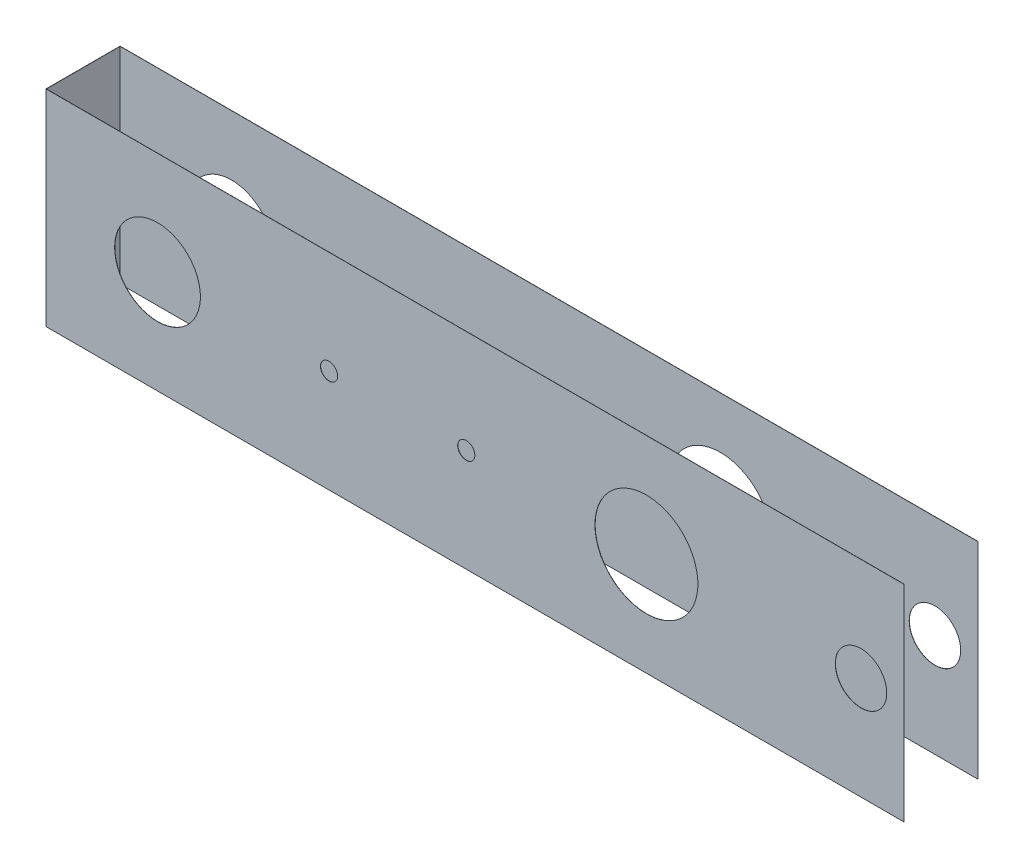
ISO-10303-21;
HEADER;
FILE_DESCRIPTION(('STEP AP214'),'2;1');
FILE_NAME('part.step','',(''),(''),'','','');
FILE_SCHEMA(('AUTOMOTIVE_DESIGN { 1 0 10303 214 1 1 1 1 }'));
ENDSEC;
DATA;
#1=APPLICATION_CONTEXT('core data for automotive mechanical design processes');
#2=APPLICATION_PROTOCOL_DEFINITION('international standard','automotive_design',2000,#1);
#3=PRODUCT_CONTEXT('',#1,'mechanical');
#4=PRODUCT('Part','Part','',(#3));
#5=PRODUCT_RELATED_PRODUCT_CATEGORY('part','',(#4));
#6=PRODUCT_DEFINITION_FORMATION('','',#4);
#7=PRODUCT_DEFINITION_CONTEXT('part definition',#1,'design');
#8=PRODUCT_DEFINITION('design','',#6,#7);
#9=PRODUCT_DEFINITION_SHAPE('','',#8);
#10=(LENGTH_UNIT() NAMED_UNIT(*) SI_UNIT(.MILLI.,.METRE.));
#11=(NAMED_UNIT(*) PLANE_ANGLE_UNIT() SI_UNIT($,.RADIAN.));
#12=(NAMED_UNIT(*) SI_UNIT($,.STERADIAN.) SOLID_ANGLE_UNIT());
#13=UNCERTAINTY_MEASURE_WITH_UNIT(LENGTH_MEASURE(1.E-05),#10,'distance_accuracy_value','');
#14=(GEOMETRIC_REPRESENTATION_CONTEXT(3) GLOBAL_UNCERTAINTY_ASSIGNED_CONTEXT((#13)) GLOBAL_UNIT_ASSIGNED_CONTEXT((#10,
#11,#12)) REPRESENTATION_CONTEXT('',''));
#15=CARTESIAN_POINT('',(0.,0.,0.));
#16=DIRECTION('',(0.,0.,1.));
#17=DIRECTION('',(1.,0.,0.));
#18=AXIS2_PLACEMENT_3D('',#15,#16,#17);
#19=CARTESIAN_POINT('',(815.722184808822,120.,-138.235459402051));
#20=DIRECTION('',(-1.,0.,0.));
#21=DIRECTION('',(0.,0.,1.));
#22=AXIS2_PLACEMENT_3D('',#19,#20,#21);
#23=PLANE('',#22);
#24=DIRECTION('',(0.,0.,-1.));
#25=VECTOR('',#24,1.);
#26=CARTESIAN_POINT('',(815.722184808822,0.,-138.235459402051));
#27=LINE('',#26,#25);
#28=CARTESIAN_POINT('',(815.722184808822,0.,-138.235459402051));
#29=VERTEX_POINT('',#28);
#30=CARTESIAN_POINT('',(815.722184808822,0.,-138.335459402051));
#31=VERTEX_POINT('',#30);
#32=EDGE_CURVE('E133',#29,#31,#27,.T.);
#33=ORIENTED_EDGE('',*,*,#32,.T.);
#34=DIRECTION('',(0.,-1.,0.));
#35=VECTOR('',#34,1.);
#36=CARTESIAN_POINT('',(815.722184808822,120.,-138.335459402051));
#37=LINE('',#36,#35);
#38=CARTESIAN_POINT('',(815.722184808822,120.,-138.335459402051));
#39=VERTEX_POINT('',#38);
#40=EDGE_CURVE('E11',#39,#31,#37,.T.);
#41=ORIENTED_EDGE('',*,*,#40,.F.);
#42=DIRECTION('',(0.,0.,-1.));
#43=VECTOR('',#42,1.);
#44=CARTESIAN_POINT('',(815.722184808822,120.,-138.235459402051));
#45=LINE('',#44,#43);
#46=CARTESIAN_POINT('',(815.722184808822,120.,-138.235459402051));
#47=VERTEX_POINT('',#46);
#48=EDGE_CURVE('E148',#47,#39,#45,.T.);
#49=ORIENTED_EDGE('',*,*,#48,.F.);
#50=DIRECTION('',(0.,-1.,0.));
#51=VECTOR('',#50,1.);
#52=CARTESIAN_POINT('',(815.722184808822,120.,-138.235459402051));
#53=LINE('',#52,#51);
#54=EDGE_CURVE('E129',#47,#29,#53,.T.);
#55=ORIENTED_EDGE('',*,*,#54,.T.);
#56=EDGE_LOOP('',(#33,#41,#49,#55));
#57=FACE_BOUND('',#56,.T.);
#58=ADVANCED_FACE('F35',(#57),#23,.F.);
#59=CARTESIAN_POINT('',(815.722184808822,120.,-138.335459402051));
#60=DIRECTION('',(0.,0.,1.));
#61=DIRECTION('',(1.,0.,0.));
#62=AXIS2_PLACEMENT_3D('',#59,#60,#61);
#63=PLANE('',#62);
#64=CARTESIAN_POINT('',(380.622184808822,60.,-138.335459402051));
#65=DIRECTION('',(0.,0.,-1.));
#66=DIRECTION('',(-1.,0.,0.));
#67=AXIS2_PLACEMENT_3D('',#64,#65,#66);
#68=CIRCLE('',#67,25.);
#69=CARTESIAN_POINT('',(355.622184808822,60.,-138.335459402051));
#70=VERTEX_POINT('',#69);
#71=EDGE_CURVE('E169',#70,#70,#68,.T.);
#72=ORIENTED_EDGE('',*,*,#71,.F.);
#73=EDGE_LOOP('',(#72));
#74=FACE_BOUND('',#73,.T.);
#75=CARTESIAN_POINT('',(480.622184808822,60.,-138.335459402051));
#76=DIRECTION('',(0.,0.,-1.));
#77=DIRECTION('',(-1.,0.,0.));
#78=AXIS2_PLACEMENT_3D('',#75,#76,#77);
#79=CIRCLE('',#78,4.99999999999999);
#80=CARTESIAN_POINT('',(475.622184808822,60.,-138.335459402051));
#81=VERTEX_POINT('',#80);
#82=EDGE_CURVE('E396',#81,#81,#79,.T.);
#83=ORIENTED_EDGE('',*,*,#82,.F.);
#84=EDGE_LOOP('',(#83));
#85=FACE_BOUND('',#84,.T.);
#86=CARTESIAN_POINT('',(560.622184808822,60.,-138.335459402051));
#87=DIRECTION('',(0.,0.,-1.));
#88=DIRECTION('',(-1.,0.,0.));
#89=AXIS2_PLACEMENT_3D('',#86,#87,#88);
#90=CIRCLE('',#89,5.00000000000005);
#91=CARTESIAN_POINT('',(555.622184808822,60.,-138.335459402051));
#92=VERTEX_POINT('',#91);
#93=EDGE_CURVE('E393',#92,#92,#90,.T.);
#94=ORIENTED_EDGE('',*,*,#93,.F.);
#95=EDGE_LOOP('',(#94));
#96=FACE_BOUND('',#95,.T.);
#97=CARTESIAN_POINT('',(665.622184808822,59.9999999999999,-138.335459402051));
#98=DIRECTION('',(0.,0.,-1.));
#99=DIRECTION('',(-1.,0.,0.));
#100=AXIS2_PLACEMENT_3D('',#97,#98,#99);
#101=CIRCLE('',#100,30.);
#102=CARTESIAN_POINT('',(635.622184808822,59.9999999999999,-138.335459402051));
#103=VERTEX_POINT('',#102);
#104=EDGE_CURVE('E390',#103,#103,#101,.T.);
#105=ORIENTED_EDGE('',*,*,#104,.F.);
#106=EDGE_LOOP('',(#105));
#107=FACE_BOUND('',#106,.T.);
#108=CARTESIAN_POINT('',(790.722184808822,60.,-138.335459402051));
#109=DIRECTION('',(0.,0.,-1.));
#110=DIRECTION('',(-1.,0.,0.));
#111=AXIS2_PLACEMENT_3D('',#108,#109,#110);
#112=CIRCLE('',#111,15.);
#113=CARTESIAN_POINT('',(775.722184808822,60.,-138.335459402051));
#114=VERTEX_POINT('',#113);
#115=EDGE_CURVE('E164',#114,#114,#112,.T.);
#116=ORIENTED_EDGE('',*,*,#115,.F.);
#117=EDGE_LOOP('',(#116));
#118=FACE_BOUND('',#117,.T.);
#119=DIRECTION('',(-1.,0.,0.));
#120=VECTOR('',#119,1.);
#121=CARTESIAN_POINT('',(815.722184808822,0.,-138.335459402051));
#122=LINE('',#121,#120);
#123=CARTESIAN_POINT('',(315.622184808822,0.,-138.335459402051));
#124=VERTEX_POINT('',#123);
#125=EDGE_CURVE('E136',#31,#124,#122,.T.);
#126=ORIENTED_EDGE('',*,*,#125,.T.);
#127=DIRECTION('',(0.,-1.,0.));
#128=VECTOR('',#127,1.);
#129=CARTESIAN_POINT('',(315.622184808822,120.,-138.335459402051));
#130=LINE('',#129,#128);
#131=CARTESIAN_POINT('',(315.622184808822,120.,-138.335459402051));
#132=VERTEX_POINT('',#131);
#133=EDGE_CURVE('E44',#132,#124,#130,.T.);
#134=ORIENTED_EDGE('',*,*,#133,.F.);
#135=DIRECTION('',(-1.,0.,0.));
#136=VECTOR('',#135,1.);
#137=CARTESIAN_POINT('',(815.722184808822,120.,-138.335459402051));
#138=LINE('',#137,#136);
#139=EDGE_CURVE('E96',#39,#132,#138,.T.);
#140=ORIENTED_EDGE('',*,*,#139,.F.);
#141=ORIENTED_EDGE('',*,*,#40,.T.);
#142=EDGE_LOOP('',(#126,#134,#140,#141));
#143=FACE_BOUND('',#142,.T.);
#144=ADVANCED_FACE('F240',(#74,#85,#96,#107,#118,#143),#63,.F.);
#145=CARTESIAN_POINT('',(315.622184808822,120.,-138.335459402051));
#146=DIRECTION('',(1.,0.,0.));
#147=DIRECTION('',(0.,0.,-1.));
#148=AXIS2_PLACEMENT_3D('',#145,#146,#147);
#149=PLANE('',#148);
#150=DIRECTION('',(0.,0.,1.));
#151=VECTOR('',#150,1.);
#152=CARTESIAN_POINT('',(315.622184808822,0.,-138.335459402051));
#153=LINE('',#152,#151);
#154=CARTESIAN_POINT('',(315.622184808822,0.,-95.1354594020514));
#155=VERTEX_POINT('',#154);
#156=EDGE_CURVE('E139',#124,#155,#153,.T.);
#157=ORIENTED_EDGE('',*,*,#156,.T.);
#158=DIRECTION('',(0.,-1.,0.));
#159=VECTOR('',#158,1.);
#160=CARTESIAN_POINT('',(315.622184808822,120.,-95.1354594020514));
#161=LINE('',#160,#159);
#162=CARTESIAN_POINT('',(315.622184808822,120.,-95.1354594020514));
#163=VERTEX_POINT('',#162);
#164=EDGE_CURVE('E155',#163,#155,#161,.T.);
#165=ORIENTED_EDGE('',*,*,#164,.F.);
#166=DIRECTION('',(0.,0.,1.));
#167=VECTOR('',#166,1.);
#168=CARTESIAN_POINT('',(315.622184808822,120.,-138.335459402051));
#169=LINE('',#168,#167);
#170=EDGE_CURVE('E207',#132,#163,#169,.T.);
#171=ORIENTED_EDGE('',*,*,#170,.F.);
#172=ORIENTED_EDGE('',*,*,#133,.T.);
#173=EDGE_LOOP('',(#157,#165,#171,#172));
#174=FACE_BOUND('',#173,.T.);
#175=ADVANCED_FACE('F244',(#174),#149,.F.);
#176=CARTESIAN_POINT('',(315.622184808822,120.,-95.1354594020514));
#177=DIRECTION('',(0.,0.,-1.));
#178=DIRECTION('',(-1.,0.,0.));
#179=AXIS2_PLACEMENT_3D('',#176,#177,#178);
#180=PLANE('',#179);
#181=CARTESIAN_POINT('',(380.622184808822,60.,-95.1354594020513));
#182=DIRECTION('',(0.,0.,-1.));
#183=DIRECTION('',(-1.,0.,0.));
#184=AXIS2_PLACEMENT_3D('',#181,#182,#183);
#185=CIRCLE('',#184,25.);
#186=CARTESIAN_POINT('',(355.622184808822,60.,-95.1354594020513));
#187=VERTEX_POINT('',#186);
#188=EDGE_CURVE('E196',#187,#187,#185,.T.);
#189=ORIENTED_EDGE('',*,*,#188,.T.);
#190=EDGE_LOOP('',(#189));
#191=FACE_BOUND('',#190,.T.);
#192=CARTESIAN_POINT('',(480.622184808822,60.,-95.1354594020513));
#193=DIRECTION('',(0.,0.,-1.));
#194=DIRECTION('',(-1.,0.,0.));
#195=AXIS2_PLACEMENT_3D('',#192,#193,#194);
#196=CIRCLE('',#195,4.99999999999999);
#197=CARTESIAN_POINT('',(475.622184808822,60.,-95.1354594020513));
#198=VERTEX_POINT('',#197);
#199=EDGE_CURVE('E181',#198,#198,#196,.T.);
#200=ORIENTED_EDGE('',*,*,#199,.T.);
#201=EDGE_LOOP('',(#200));
#202=FACE_BOUND('',#201,.T.);
#203=CARTESIAN_POINT('',(560.622184808822,60.,-95.1354594020513));
#204=DIRECTION('',(0.,0.,-1.));
#205=DIRECTION('',(-1.,0.,0.));
#206=AXIS2_PLACEMENT_3D('',#203,#204,#205);
#207=CIRCLE('',#206,5.00000000000005);
#208=CARTESIAN_POINT('',(555.622184808822,60.,-95.1354594020513));
#209=VERTEX_POINT('',#208);
#210=EDGE_CURVE('E177',#209,#209,#207,.T.);
#211=ORIENTED_EDGE('',*,*,#210,.T.);
#212=EDGE_LOOP('',(#211));
#213=FACE_BOUND('',#212,.T.);
#214=CARTESIAN_POINT('',(665.622184808822,59.9999999999999,-95.1354594020513));
#215=DIRECTION('',(0.,0.,-1.));
#216=DIRECTION('',(-1.,0.,0.));
#217=AXIS2_PLACEMENT_3D('',#214,#215,#216);
#218=CIRCLE('',#217,30.);
#219=CARTESIAN_POINT('',(635.622184808822,59.9999999999999,-95.1354594020513));
#220=VERTEX_POINT('',#219);
#221=EDGE_CURVE('E173',#220,#220,#218,.T.);
#222=ORIENTED_EDGE('',*,*,#221,.T.);
#223=EDGE_LOOP('',(#222));
#224=FACE_BOUND('',#223,.T.);
#225=CARTESIAN_POINT('',(790.722184808822,60.,-95.1354594020513));
#226=DIRECTION('',(0.,0.,-1.));
#227=DIRECTION('',(-1.,0.,0.));
#228=AXIS2_PLACEMENT_3D('',#225,#226,#227);
#229=CIRCLE('',#228,15.);
#230=CARTESIAN_POINT('',(775.722184808822,60.,-95.1354594020513));
#231=VERTEX_POINT('',#230);
#232=EDGE_CURVE('E137',#231,#231,#229,.T.);
#233=ORIENTED_EDGE('',*,*,#232,.T.);
#234=EDGE_LOOP('',(#233));
#235=FACE_BOUND('',#234,.T.);
#236=DIRECTION('',(1.,0.,0.));
#237=VECTOR('',#236,1.);
#238=CARTESIAN_POINT('',(315.622184808822,0.,-95.1354594020514));
#239=LINE('',#238,#237);
#240=CARTESIAN_POINT('',(815.722184808822,0.,-95.1354594020513));
#241=VERTEX_POINT('',#240);
#242=EDGE_CURVE('E141',#155,#241,#239,.T.);
#243=ORIENTED_EDGE('',*,*,#242,.T.);
#244=DIRECTION('',(0.,-1.,0.));
#245=VECTOR('',#244,1.);
#246=CARTESIAN_POINT('',(815.722184808822,120.,-95.1354594020513));
#247=LINE('',#246,#245);
#248=CARTESIAN_POINT('',(815.722184808822,120.,-95.1354594020513));
#249=VERTEX_POINT('',#248);
#250=EDGE_CURVE('E152',#249,#241,#247,.T.);
#251=ORIENTED_EDGE('',*,*,#250,.F.);
#252=DIRECTION('',(1.,0.,0.));
#253=VECTOR('',#252,1.);
#254=CARTESIAN_POINT('',(315.622184808822,120.,-95.1354594020514));
#255=LINE('',#254,#253);
#256=EDGE_CURVE('E209',#163,#249,#255,.T.);
#257=ORIENTED_EDGE('',*,*,#256,.F.);
#258=ORIENTED_EDGE('',*,*,#164,.T.);
#259=EDGE_LOOP('',(#243,#251,#257,#258));
#260=FACE_BOUND('',#259,.T.);
#261=ADVANCED_FACE('F215',(#191,#202,#213,#224,#235,#260),#180,.F.);
#262=CARTESIAN_POINT('',(815.722184808822,120.,-95.1354594020513));
#263=DIRECTION('',(-1.,0.,0.));
#264=DIRECTION('',(0.,0.,1.));
#265=AXIS2_PLACEMENT_3D('',#262,#263,#264);
#266=PLANE('',#265);
#267=DIRECTION('',(0.,0.,-1.));
#268=VECTOR('',#267,1.);
#269=CARTESIAN_POINT('',(815.722184808822,0.,-95.1354594020513));
#270=LINE('',#269,#268);
#271=CARTESIAN_POINT('',(815.722184808822,0.,-95.2354594020514));
#272=VERTEX_POINT('',#271);
#273=EDGE_CURVE('E143',#241,#272,#270,.T.);
#274=ORIENTED_EDGE('',*,*,#273,.T.);
#275=DIRECTION('',(0.,-1.,0.));
#276=VECTOR('',#275,1.);
#277=CARTESIAN_POINT('',(815.722184808822,120.,-95.2354594020514));
#278=LINE('',#277,#276);
#279=CARTESIAN_POINT('',(815.722184808822,120.,-95.2354594020514));
#280=VERTEX_POINT('',#279);
#281=EDGE_CURVE('E124',#280,#272,#278,.T.);
#282=ORIENTED_EDGE('',*,*,#281,.F.);
#283=DIRECTION('',(0.,0.,-1.));
#284=VECTOR('',#283,1.);
#285=CARTESIAN_POINT('',(815.722184808822,120.,-95.1354594020513));
#286=LINE('',#285,#284);
#287=EDGE_CURVE('E115',#249,#280,#286,.T.);
#288=ORIENTED_EDGE('',*,*,#287,.F.);
#289=ORIENTED_EDGE('',*,*,#250,.T.);
#290=EDGE_LOOP('',(#274,#282,#288,#289));
#291=FACE_BOUND('',#290,.T.);
#292=ADVANCED_FACE('F219',(#291),#266,.F.);
#293=CARTESIAN_POINT('',(815.722184808822,120.,-95.2354594020514));
#294=DIRECTION('',(0.,0.,1.));
#295=DIRECTION('',(1.,0.,0.));
#296=AXIS2_PLACEMENT_3D('',#293,#294,#295);
#297=PLANE('',#296);
#298=CARTESIAN_POINT('',(380.622184808822,60.,-95.2354594020514));
#299=DIRECTION('',(0.,0.,1.));
#300=DIRECTION('',(1.,0.,0.));
#301=AXIS2_PLACEMENT_3D('',#298,#299,#300);
#302=CIRCLE('',#301,25.);
#303=CARTESIAN_POINT('',(405.622184808822,60.,-95.2354594020514));
#304=VERTEX_POINT('',#303);
#305=EDGE_CURVE('E193',#304,#304,#302,.T.);
#306=ORIENTED_EDGE('',*,*,#305,.T.);
#307=EDGE_LOOP('',(#306));
#308=FACE_BOUND('',#307,.T.);
#309=CARTESIAN_POINT('',(480.622184808822,60.,-95.2354594020514));
#310=DIRECTION('',(0.,0.,1.));
#311=DIRECTION('',(1.,0.,0.));
#312=AXIS2_PLACEMENT_3D('',#309,#310,#311);
#313=CIRCLE('',#312,4.99999999999999);
#314=CARTESIAN_POINT('',(485.622184808822,60.,-95.2354594020514));
#315=VERTEX_POINT('',#314);
#316=EDGE_CURVE('E176',#315,#315,#313,.T.);
#317=ORIENTED_EDGE('',*,*,#316,.T.);
#318=EDGE_LOOP('',(#317));
#319=FACE_BOUND('',#318,.T.);
#320=CARTESIAN_POINT('',(560.622184808822,60.,-95.2354594020514));
#321=DIRECTION('',(0.,0.,1.));
#322=DIRECTION('',(1.,0.,0.));
#323=AXIS2_PLACEMENT_3D('',#320,#321,#322);
#324=CIRCLE('',#323,5.00000000000005);
#325=CARTESIAN_POINT('',(565.622184808822,60.,-95.2354594020514));
#326=VERTEX_POINT('',#325);
#327=EDGE_CURVE('E172',#326,#326,#324,.T.);
#328=ORIENTED_EDGE('',*,*,#327,.T.);
#329=EDGE_LOOP('',(#328));
#330=FACE_BOUND('',#329,.T.);
#331=CARTESIAN_POINT('',(665.622184808822,59.9999999999999,-95.2354594020514));
#332=DIRECTION('',(0.,0.,1.));
#333=DIRECTION('',(1.,0.,0.));
#334=AXIS2_PLACEMENT_3D('',#331,#332,#333);
#335=CIRCLE('',#334,30.);
#336=CARTESIAN_POINT('',(695.622184808822,59.9999999999999,-95.2354594020514));
#337=VERTEX_POINT('',#336);
#338=EDGE_CURVE('E168',#337,#337,#335,.T.);
#339=ORIENTED_EDGE('',*,*,#338,.T.);
#340=EDGE_LOOP('',(#339));
#341=FACE_BOUND('',#340,.T.);
#342=CARTESIAN_POINT('',(790.722184808822,60.,-95.2354594020514));
#343=DIRECTION('',(0.,0.,1.));
#344=DIRECTION('',(1.,0.,0.));
#345=AXIS2_PLACEMENT_3D('',#342,#343,#344);
#346=CIRCLE('',#345,15.);
#347=CARTESIAN_POINT('',(805.722184808822,60.,-95.2354594020514));
#348=VERTEX_POINT('',#347);
#349=EDGE_CURVE('E163',#348,#348,#346,.T.);
#350=ORIENTED_EDGE('',*,*,#349,.T.);
#351=EDGE_LOOP('',(#350));
#352=FACE_BOUND('',#351,.T.);
#353=DIRECTION('',(-1.,0.,0.));
#354=VECTOR('',#353,1.);
#355=CARTESIAN_POINT('',(815.722184808822,0.,-95.2354594020514));
#356=LINE('',#355,#354);
#357=CARTESIAN_POINT('',(315.722184808822,0.,-95.2354594020514));
#358=VERTEX_POINT('',#357);
#359=EDGE_CURVE('E123',#272,#358,#356,.T.);
#360=ORIENTED_EDGE('',*,*,#359,.T.);
#361=DIRECTION('',(0.,-1.,0.));
#362=VECTOR('',#361,1.);
#363=CARTESIAN_POINT('',(315.722184808822,120.,-95.2354594020514));
#364=LINE('',#363,#362);
#365=CARTESIAN_POINT('',(315.722184808822,120.,-95.2354594020514));
#366=VERTEX_POINT('',#365);
#367=EDGE_CURVE('E120',#366,#358,#364,.T.);
#368=ORIENTED_EDGE('',*,*,#367,.F.);
#369=DIRECTION('',(-1.,0.,0.));
#370=VECTOR('',#369,1.);
#371=CARTESIAN_POINT('',(815.722184808822,120.,-95.2354594020514));
#372=LINE('',#371,#370);
#373=EDGE_CURVE('E109',#280,#366,#372,.T.);
#374=ORIENTED_EDGE('',*,*,#373,.F.);
#375=ORIENTED_EDGE('',*,*,#281,.T.);
#376=EDGE_LOOP('',(#360,#368,#374,#375));
#377=FACE_BOUND('',#376,.T.);
#378=ADVANCED_FACE('F121',(#308,#319,#330,#341,#352,#377),#297,.F.);
#379=CARTESIAN_POINT('',(315.722184808822,120.,-95.2354594020514));
#380=DIRECTION('',(-1.,0.,0.));
#381=DIRECTION('',(0.,0.,1.));
#382=AXIS2_PLACEMENT_3D('',#379,#380,#381);
#383=PLANE('',#382);
#384=DIRECTION('',(0.,0.,-1.));
#385=VECTOR('',#384,1.);
#386=CARTESIAN_POINT('',(315.722184808822,0.,-95.2354594020514));
#387=LINE('',#386,#385);
#388=CARTESIAN_POINT('',(315.722184808822,0.,-138.235459402051));
#389=VERTEX_POINT('',#388);
#390=EDGE_CURVE('E82',#358,#389,#387,.T.);
#391=ORIENTED_EDGE('',*,*,#390,.T.);
#392=DIRECTION('',(0.,-1.,0.));
#393=VECTOR('',#392,1.);
#394=CARTESIAN_POINT('',(315.722184808822,120.,-138.235459402051));
#395=LINE('',#394,#393);
#396=CARTESIAN_POINT('',(315.722184808822,120.,-138.235459402051));
#397=VERTEX_POINT('',#396);
#398=EDGE_CURVE('E125',#397,#389,#395,.T.);
#399=ORIENTED_EDGE('',*,*,#398,.F.);
#400=DIRECTION('',(0.,0.,-1.));
#401=VECTOR('',#400,1.);
#402=CARTESIAN_POINT('',(315.722184808822,120.,-95.2354594020514));
#403=LINE('',#402,#401);
#404=EDGE_CURVE('E113',#366,#397,#403,.T.);
#405=ORIENTED_EDGE('',*,*,#404,.F.);
#406=ORIENTED_EDGE('',*,*,#367,.T.);
#407=EDGE_LOOP('',(#391,#399,#405,#406));
#408=FACE_BOUND('',#407,.T.);
#409=ADVANCED_FACE('F127',(#408),#383,.F.);
#410=CARTESIAN_POINT('',(315.722184808822,120.,-138.235459402051));
#411=DIRECTION('',(0.,0.,-1.));
#412=DIRECTION('',(-1.,0.,0.));
#413=AXIS2_PLACEMENT_3D('',#410,#411,#412);
#414=PLANE('',#413);
#415=CARTESIAN_POINT('',(380.622184808822,60.,-138.235459402051));
#416=DIRECTION('',(0.,0.,-1.));
#417=DIRECTION('',(-1.,0.,0.));
#418=AXIS2_PLACEMENT_3D('',#415,#416,#417);
#419=CIRCLE('',#418,25.);
#420=CARTESIAN_POINT('',(355.622184808822,60.,-138.235459402051));
#421=VERTEX_POINT('',#420);
#422=EDGE_CURVE('E38',#421,#421,#419,.T.);
#423=ORIENTED_EDGE('',*,*,#422,.T.);
#424=EDGE_LOOP('',(#423));
#425=FACE_BOUND('',#424,.T.);
#426=CARTESIAN_POINT('',(480.622184808822,60.,-138.235459402051));
#427=DIRECTION('',(0.,0.,-1.));
#428=DIRECTION('',(-1.,0.,0.));
#429=AXIS2_PLACEMENT_3D('',#426,#427,#428);
#430=CIRCLE('',#429,4.99999999999999);
#431=CARTESIAN_POINT('',(475.622184808822,60.,-138.235459402051));
#432=VERTEX_POINT('',#431);
#433=EDGE_CURVE('E174',#432,#432,#430,.T.);
#434=ORIENTED_EDGE('',*,*,#433,.T.);
#435=EDGE_LOOP('',(#434));
#436=FACE_BOUND('',#435,.T.);
#437=CARTESIAN_POINT('',(560.622184808822,60.,-138.235459402051));
#438=DIRECTION('',(0.,0.,-1.));
#439=DIRECTION('',(-1.,0.,0.));
#440=AXIS2_PLACEMENT_3D('',#437,#438,#439);
#441=CIRCLE('',#440,5.00000000000005);
#442=CARTESIAN_POINT('',(555.622184808822,60.,-138.235459402051));
#443=VERTEX_POINT('',#442);
#444=EDGE_CURVE('E170',#443,#443,#441,.T.);
#445=ORIENTED_EDGE('',*,*,#444,.T.);
#446=EDGE_LOOP('',(#445));
#447=FACE_BOUND('',#446,.T.);
#448=CARTESIAN_POINT('',(665.622184808822,59.9999999999999,-138.235459402051));
#449=DIRECTION('',(0.,0.,-1.));
#450=DIRECTION('',(-1.,0.,0.));
#451=AXIS2_PLACEMENT_3D('',#448,#449,#450);
#452=CIRCLE('',#451,30.);
#453=CARTESIAN_POINT('',(635.622184808822,59.9999999999999,-138.235459402051));
#454=VERTEX_POINT('',#453);
#455=EDGE_CURVE('E165',#454,#454,#452,.T.);
#456=ORIENTED_EDGE('',*,*,#455,.T.);
#457=EDGE_LOOP('',(#456));
#458=FACE_BOUND('',#457,.T.);
#459=CARTESIAN_POINT('',(790.722184808822,60.,-138.235459402051));
#460=DIRECTION('',(0.,0.,-1.));
#461=DIRECTION('',(-1.,0.,0.));
#462=AXIS2_PLACEMENT_3D('',#459,#460,#461);
#463=CIRCLE('',#462,15.);
#464=CARTESIAN_POINT('',(775.722184808822,60.,-138.235459402051));
#465=VERTEX_POINT('',#464);
#466=EDGE_CURVE('E160',#465,#465,#463,.T.);
#467=ORIENTED_EDGE('',*,*,#466,.T.);
#468=EDGE_LOOP('',(#467));
#469=FACE_BOUND('',#468,.T.);
#470=DIRECTION('',(1.,0.,0.));
#471=VECTOR('',#470,1.);
#472=CARTESIAN_POINT('',(315.722184808822,0.,-138.235459402051));
#473=LINE('',#472,#471);
#474=EDGE_CURVE('E88',#389,#29,#473,.T.);
#475=ORIENTED_EDGE('',*,*,#474,.T.);
#476=ORIENTED_EDGE('',*,*,#54,.F.);
#477=DIRECTION('',(1.,0.,0.));
#478=VECTOR('',#477,1.);
#479=CARTESIAN_POINT('',(315.722184808822,120.,-138.235459402051));
#480=LINE('',#479,#478);
#481=EDGE_CURVE('E53',#397,#47,#480,.T.);
#482=ORIENTED_EDGE('',*,*,#481,.F.);
#483=ORIENTED_EDGE('',*,*,#398,.T.);
#484=EDGE_LOOP('',(#475,#476,#482,#483));
#485=FACE_BOUND('',#484,.T.);
#486=ADVANCED_FACE('F227',(#425,#436,#447,#458,#469,#485),#414,.F.);
#487=CARTESIAN_POINT('',(0.,120.,0.));
#488=DIRECTION('',(0.,1.,0.));
#489=DIRECTION('',(0.,0.,1.));
#490=AXIS2_PLACEMENT_3D('',#487,#488,#489);
#491=PLANE('',#490);
#492=ORIENTED_EDGE('',*,*,#48,.T.);
#493=ORIENTED_EDGE('',*,*,#139,.T.);
#494=ORIENTED_EDGE('',*,*,#170,.T.);
#495=ORIENTED_EDGE('',*,*,#256,.T.);
#496=ORIENTED_EDGE('',*,*,#287,.T.);
#497=ORIENTED_EDGE('',*,*,#373,.T.);
#498=ORIENTED_EDGE('',*,*,#404,.T.);
#499=ORIENTED_EDGE('',*,*,#481,.T.);
#500=EDGE_LOOP('',(#492,#493,#494,#495,#496,#497,#498,#499));
#501=FACE_BOUND('',#500,.T.);
#502=ADVANCED_FACE('F111',(#501),#491,.T.);
#503=CARTESIAN_POINT('',(0.,0.,0.));
#504=DIRECTION('',(0.,1.,0.));
#505=DIRECTION('',(0.,0.,1.));
#506=AXIS2_PLACEMENT_3D('',#503,#504,#505);
#507=PLANE('',#506);
#508=ORIENTED_EDGE('',*,*,#32,.F.);
#509=ORIENTED_EDGE('',*,*,#474,.F.);
#510=ORIENTED_EDGE('',*,*,#390,.F.);
#511=ORIENTED_EDGE('',*,*,#359,.F.);
#512=ORIENTED_EDGE('',*,*,#273,.F.);
#513=ORIENTED_EDGE('',*,*,#242,.F.);
#514=ORIENTED_EDGE('',*,*,#156,.F.);
#515=ORIENTED_EDGE('',*,*,#125,.F.);
#516=EDGE_LOOP('',(#508,#509,#510,#511,#512,#513,#514,#515));
#517=FACE_BOUND('',#516,.T.);
#518=ADVANCED_FACE('F222',(#517),#507,.F.);
#519=CARTESIAN_POINT('',(790.722184808822,60.,-18.3354594020514));
#520=DIRECTION('',(0.,0.,-1.));
#521=DIRECTION('',(-1.,0.,0.));
#522=AXIS2_PLACEMENT_3D('',#519,#520,#521);
#523=CYLINDRICAL_SURFACE('',#522,15.);
#524=ORIENTED_EDGE('',*,*,#115,.T.);
#525=EDGE_LOOP('',(#524));
#526=FACE_BOUND('',#525,.T.);
#527=ORIENTED_EDGE('',*,*,#466,.F.);
#528=EDGE_LOOP('',(#527));
#529=FACE_BOUND('',#528,.T.);
#530=ADVANCED_FACE('F278',(#526,#529),#523,.F.);
#531=ORIENTED_EDGE('',*,*,#349,.F.);
#532=EDGE_LOOP('',(#531));
#533=FACE_BOUND('',#532,.T.);
#534=ORIENTED_EDGE('',*,*,#232,.F.);
#535=EDGE_LOOP('',(#534));
#536=FACE_BOUND('',#535,.T.);
#537=ADVANCED_FACE('F274',(#533,#536),#523,.F.);
#538=CARTESIAN_POINT('',(665.622184808822,59.9999999999999,-18.3354594020514));
#539=DIRECTION('',(0.,0.,-1.));
#540=DIRECTION('',(-1.,0.,0.));
#541=AXIS2_PLACEMENT_3D('',#538,#539,#540);
#542=CYLINDRICAL_SURFACE('',#541,30.);
#543=ORIENTED_EDGE('',*,*,#104,.T.);
#544=EDGE_LOOP('',(#543));
#545=FACE_BOUND('',#544,.T.);
#546=ORIENTED_EDGE('',*,*,#455,.F.);
#547=EDGE_LOOP('',(#546));
#548=FACE_BOUND('',#547,.T.);
#549=ADVANCED_FACE('F277',(#545,#548),#542,.F.);
#550=CARTESIAN_POINT('',(560.622184808822,60.,-18.3354594020514));
#551=DIRECTION('',(0.,0.,-1.));
#552=DIRECTION('',(-1.,0.,0.));
#553=AXIS2_PLACEMENT_3D('',#550,#551,#552);
#554=CYLINDRICAL_SURFACE('',#553,5.00000000000005);
#555=ORIENTED_EDGE('',*,*,#93,.T.);
#556=EDGE_LOOP('',(#555));
#557=FACE_BOUND('',#556,.T.);
#558=ORIENTED_EDGE('',*,*,#444,.F.);
#559=EDGE_LOOP('',(#558));
#560=FACE_BOUND('',#559,.T.);
#561=ADVANCED_FACE('F286',(#557,#560),#554,.F.);
#562=CARTESIAN_POINT('',(480.622184808822,60.,-18.3354594020514));
#563=DIRECTION('',(0.,0.,-1.));
#564=DIRECTION('',(-1.,0.,0.));
#565=AXIS2_PLACEMENT_3D('',#562,#563,#564);
#566=CYLINDRICAL_SURFACE('',#565,4.99999999999999);
#567=ORIENTED_EDGE('',*,*,#82,.T.);
#568=EDGE_LOOP('',(#567));
#569=FACE_BOUND('',#568,.T.);
#570=ORIENTED_EDGE('',*,*,#433,.F.);
#571=EDGE_LOOP('',(#570));
#572=FACE_BOUND('',#571,.T.);
#573=ADVANCED_FACE('F322',(#569,#572),#566,.F.);
#574=CARTESIAN_POINT('',(380.622184808822,60.,-18.3354594020514));
#575=DIRECTION('',(0.,0.,-1.));
#576=DIRECTION('',(-1.,0.,0.));
#577=AXIS2_PLACEMENT_3D('',#574,#575,#576);
#578=CYLINDRICAL_SURFACE('',#577,25.);
#579=ORIENTED_EDGE('',*,*,#71,.T.);
#580=EDGE_LOOP('',(#579));
#581=FACE_BOUND('',#580,.T.);
#582=ORIENTED_EDGE('',*,*,#422,.F.);
#583=EDGE_LOOP('',(#582));
#584=FACE_BOUND('',#583,.T.);
#585=ADVANCED_FACE('F332',(#581,#584),#578,.F.);
#586=ORIENTED_EDGE('',*,*,#338,.F.);
#587=EDGE_LOOP('',(#586));
#588=FACE_BOUND('',#587,.T.);
#589=ORIENTED_EDGE('',*,*,#221,.F.);
#590=EDGE_LOOP('',(#589));
#591=FACE_BOUND('',#590,.T.);
#592=ADVANCED_FACE('F289',(#588,#591),#542,.F.);
#593=ORIENTED_EDGE('',*,*,#327,.F.);
#594=EDGE_LOOP('',(#593));
#595=FACE_BOUND('',#594,.T.);
#596=ORIENTED_EDGE('',*,*,#210,.F.);
#597=EDGE_LOOP('',(#596));
#598=FACE_BOUND('',#597,.T.);
#599=ADVANCED_FACE('F324',(#595,#598),#554,.F.);
#600=ORIENTED_EDGE('',*,*,#316,.F.);
#601=EDGE_LOOP('',(#600));
#602=FACE_BOUND('',#601,.T.);
#603=ORIENTED_EDGE('',*,*,#199,.F.);
#604=EDGE_LOOP('',(#603));
#605=FACE_BOUND('',#604,.T.);
#606=ADVANCED_FACE('F335',(#602,#605),#566,.F.);
#607=ORIENTED_EDGE('',*,*,#305,.F.);
#608=EDGE_LOOP('',(#607));
#609=FACE_BOUND('',#608,.T.);
#610=ORIENTED_EDGE('',*,*,#188,.F.);
#611=EDGE_LOOP('',(#610));
#612=FACE_BOUND('',#611,.T.);
#613=ADVANCED_FACE('F345',(#609,#612),#578,.F.);
#614=CLOSED_SHELL('',(#58,#144,#175,#261,#292,#378,#409,#486,#502,#518,#530,#537,#549,#561,#573,
#585,#592,#599,#606,#613));
#615=MANIFOLD_SOLID_BREP('B2',#614);
#616=ADVANCED_BREP_SHAPE_REPRESENTATION('',(#18,#615),#14);
#617=SHAPE_DEFINITION_REPRESENTATION(#9,#616);
ENDSEC;
END-ISO-10303-21;
